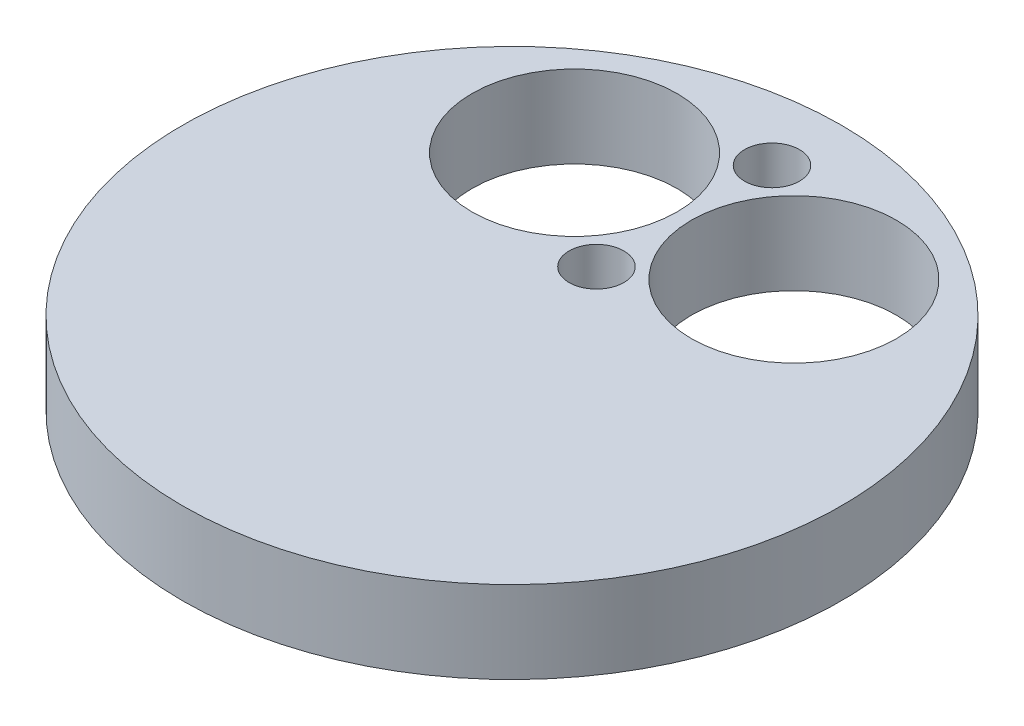
ISO-10303-21;
HEADER;
FILE_DESCRIPTION(('STEP AP214'),'2;1');
FILE_NAME('part.step','',(''),(''),'','','');
FILE_SCHEMA(('AUTOMOTIVE_DESIGN { 1 0 10303 214 1 1 1 1 }'));
ENDSEC;
DATA;
#1=APPLICATION_CONTEXT('core data for automotive mechanical design processes');
#2=APPLICATION_PROTOCOL_DEFINITION('international standard','automotive_design',2000,#1);
#3=PRODUCT_CONTEXT('',#1,'mechanical');
#4=PRODUCT('Part','Part','',(#3));
#5=PRODUCT_RELATED_PRODUCT_CATEGORY('part','',(#4));
#6=PRODUCT_DEFINITION_FORMATION('','',#4);
#7=PRODUCT_DEFINITION_CONTEXT('part definition',#1,'design');
#8=PRODUCT_DEFINITION('design','',#6,#7);
#9=PRODUCT_DEFINITION_SHAPE('','',#8);
#10=(LENGTH_UNIT() NAMED_UNIT(*) SI_UNIT(.MILLI.,.METRE.));
#11=(NAMED_UNIT(*) PLANE_ANGLE_UNIT() SI_UNIT($,.RADIAN.));
#12=(NAMED_UNIT(*) SI_UNIT($,.STERADIAN.) SOLID_ANGLE_UNIT());
#13=UNCERTAINTY_MEASURE_WITH_UNIT(LENGTH_MEASURE(1.E-05),#10,'distance_accuracy_value','');
#14=(GEOMETRIC_REPRESENTATION_CONTEXT(3) GLOBAL_UNCERTAINTY_ASSIGNED_CONTEXT((#13)) GLOBAL_UNIT_ASSIGNED_CONTEXT((#10,
#11,#12)) REPRESENTATION_CONTEXT('',''));
#15=CARTESIAN_POINT('',(0.,0.,0.));
#16=DIRECTION('',(0.,0.,1.));
#17=DIRECTION('',(1.,0.,0.));
#18=AXIS2_PLACEMENT_3D('',#15,#16,#17);
#19=CARTESIAN_POINT('',(0.,9.525,0.));
#20=DIRECTION('',(0.,1.,0.));
#21=DIRECTION('',(0.,0.,1.));
#22=AXIS2_PLACEMENT_3D('',#19,#20,#21);
#23=PLANE('',#22);
#24=CARTESIAN_POINT('',(0.,9.525,-30.099));
#25=DIRECTION('',(0.,1.,0.));
#26=DIRECTION('',(0.,0.,1.));
#27=AXIS2_PLACEMENT_3D('',#24,#25,#26);
#28=CIRCLE('',#27,3.175);
#29=CARTESIAN_POINT('',(0.,9.525,-33.274));
#30=VERTEX_POINT('',#29);
#31=EDGE_CURVE('E55',#30,#30,#28,.T.);
#32=ORIENTED_EDGE('',*,*,#31,.F.);
#33=EDGE_LOOP('',(#32));
#34=FACE_BOUND('',#33,.T.);
#35=CARTESIAN_POINT('',(12.7,9.525,-19.939));
#36=DIRECTION('',(0.,1.,0.));
#37=DIRECTION('',(0.,0.,1.));
#38=AXIS2_PLACEMENT_3D('',#35,#36,#37);
#39=CIRCLE('',#38,11.8745);
#40=CARTESIAN_POINT('',(12.7,9.525,-31.8135));
#41=VERTEX_POINT('',#40);
#42=EDGE_CURVE('E44',#41,#41,#39,.T.);
#43=ORIENTED_EDGE('',*,*,#42,.F.);
#44=EDGE_LOOP('',(#43));
#45=FACE_BOUND('',#44,.T.);
#46=CARTESIAN_POINT('',(0.,9.525,0.));
#47=DIRECTION('',(0.,1.,0.));
#48=DIRECTION('',(0.,0.,1.));
#49=AXIS2_PLACEMENT_3D('',#46,#47,#48);
#50=CIRCLE('',#49,38.1508);
#51=CARTESIAN_POINT('',(0.,9.525,-38.1508));
#52=VERTEX_POINT('',#51);
#53=EDGE_CURVE('E10',#52,#52,#50,.T.);
#54=ORIENTED_EDGE('',*,*,#53,.T.);
#55=EDGE_LOOP('',(#54));
#56=FACE_BOUND('',#55,.T.);
#57=CARTESIAN_POINT('',(-12.7,9.525,-19.939));
#58=DIRECTION('',(0.,1.,0.));
#59=DIRECTION('',(0.,0.,1.));
#60=AXIS2_PLACEMENT_3D('',#57,#58,#59);
#61=CIRCLE('',#60,11.8745);
#62=CARTESIAN_POINT('',(-12.7,9.525,-31.8135));
#63=VERTEX_POINT('',#62);
#64=EDGE_CURVE('E49',#63,#63,#61,.T.);
#65=ORIENTED_EDGE('',*,*,#64,.F.);
#66=EDGE_LOOP('',(#65));
#67=FACE_BOUND('',#66,.T.);
#68=CARTESIAN_POINT('',(0.,9.525,-9.779));
#69=DIRECTION('',(0.,1.,0.));
#70=DIRECTION('',(0.,0.,1.));
#71=AXIS2_PLACEMENT_3D('',#68,#69,#70);
#72=CIRCLE('',#71,3.175);
#73=CARTESIAN_POINT('',(0.,9.525,-12.954));
#74=VERTEX_POINT('',#73);
#75=EDGE_CURVE('E61',#74,#74,#72,.T.);
#76=ORIENTED_EDGE('',*,*,#75,.F.);
#77=EDGE_LOOP('',(#76));
#78=FACE_BOUND('',#77,.T.);
#79=ADVANCED_FACE('F33',(#34,#45,#56,#67,#78),#23,.T.);
#80=CARTESIAN_POINT('',(0.,0.,0.));
#81=DIRECTION('',(0.,1.,0.));
#82=DIRECTION('',(0.,0.,1.));
#83=AXIS2_PLACEMENT_3D('',#80,#81,#82);
#84=PLANE('',#83);
#85=CARTESIAN_POINT('',(0.,0.,0.));
#86=DIRECTION('',(0.,1.,0.));
#87=DIRECTION('',(0.,0.,1.));
#88=AXIS2_PLACEMENT_3D('',#85,#86,#87);
#89=CIRCLE('',#88,38.1508);
#90=CARTESIAN_POINT('',(0.,0.,-38.1508));
#91=VERTEX_POINT('',#90);
#92=EDGE_CURVE('E37',#91,#91,#89,.T.);
#93=ORIENTED_EDGE('',*,*,#92,.F.);
#94=EDGE_LOOP('',(#93));
#95=FACE_BOUND('',#94,.T.);
#96=CARTESIAN_POINT('',(12.7,0.,-19.939));
#97=DIRECTION('',(0.,1.,0.));
#98=DIRECTION('',(0.,0.,1.));
#99=AXIS2_PLACEMENT_3D('',#96,#97,#98);
#100=CIRCLE('',#99,11.8745);
#101=CARTESIAN_POINT('',(12.7,0.,-31.8135));
#102=VERTEX_POINT('',#101);
#103=EDGE_CURVE('E46',#102,#102,#100,.T.);
#104=ORIENTED_EDGE('',*,*,#103,.T.);
#105=EDGE_LOOP('',(#104));
#106=FACE_BOUND('',#105,.T.);
#107=CARTESIAN_POINT('',(-12.7,0.,-19.939));
#108=DIRECTION('',(0.,1.,0.));
#109=DIRECTION('',(0.,0.,1.));
#110=AXIS2_PLACEMENT_3D('',#107,#108,#109);
#111=CIRCLE('',#110,11.8745);
#112=CARTESIAN_POINT('',(-12.7,0.,-31.8135));
#113=VERTEX_POINT('',#112);
#114=EDGE_CURVE('E52',#113,#113,#111,.T.);
#115=ORIENTED_EDGE('',*,*,#114,.T.);
#116=EDGE_LOOP('',(#115));
#117=FACE_BOUND('',#116,.T.);
#118=CARTESIAN_POINT('',(0.,0.,-30.099));
#119=DIRECTION('',(0.,1.,0.));
#120=DIRECTION('',(0.,0.,1.));
#121=AXIS2_PLACEMENT_3D('',#118,#119,#120);
#122=CIRCLE('',#121,3.175);
#123=CARTESIAN_POINT('',(0.,0.,-33.274));
#124=VERTEX_POINT('',#123);
#125=EDGE_CURVE('E58',#124,#124,#122,.T.);
#126=ORIENTED_EDGE('',*,*,#125,.T.);
#127=EDGE_LOOP('',(#126));
#128=FACE_BOUND('',#127,.T.);
#129=CARTESIAN_POINT('',(0.,0.,-9.779));
#130=DIRECTION('',(0.,1.,0.));
#131=DIRECTION('',(0.,0.,1.));
#132=AXIS2_PLACEMENT_3D('',#129,#130,#131);
#133=CIRCLE('',#132,3.175);
#134=CARTESIAN_POINT('',(0.,0.,-12.954));
#135=VERTEX_POINT('',#134);
#136=EDGE_CURVE('E64',#135,#135,#133,.T.);
#137=ORIENTED_EDGE('',*,*,#136,.T.);
#138=EDGE_LOOP('',(#137));
#139=FACE_BOUND('',#138,.T.);
#140=ADVANCED_FACE('F74',(#95,#106,#117,#128,#139),#84,.F.);
#141=CARTESIAN_POINT('',(0.,9.525,0.));
#142=DIRECTION('',(0.,-1.,0.));
#143=DIRECTION('',(0.,0.,-1.));
#144=AXIS2_PLACEMENT_3D('',#141,#142,#143);
#145=CYLINDRICAL_SURFACE('',#144,38.1508);
#146=CARTESIAN_POINT('',(0.,9.525,-38.1508));
#147=CARTESIAN_POINT('',(0.,9.42578125,-38.1508));
#148=CARTESIAN_POINT('',(0.,9.3265625,-38.1508));
#149=CARTESIAN_POINT('',(0.,9.128125,-38.1508));
#150=CARTESIAN_POINT('',(0.,9.02890625,-38.1508));
#151=CARTESIAN_POINT('',(0.,8.83046875,-38.1508));
#152=CARTESIAN_POINT('',(0.,8.73125,-38.1508));
#153=CARTESIAN_POINT('',(0.,8.5328125,-38.1508));
#154=CARTESIAN_POINT('',(0.,8.43359375,-38.1508));
#155=CARTESIAN_POINT('',(0.,8.23515625,-38.1508));
#156=CARTESIAN_POINT('',(0.,8.1359375,-38.1508));
#157=CARTESIAN_POINT('',(0.,7.9375,-38.1508));
#158=CARTESIAN_POINT('',(0.,7.83828125,-38.1508));
#159=CARTESIAN_POINT('',(0.,7.63984375,-38.1508));
#160=CARTESIAN_POINT('',(0.,7.540625,-38.1508));
#161=CARTESIAN_POINT('',(0.,7.3421875,-38.1508));
#162=CARTESIAN_POINT('',(0.,7.24296875,-38.1508));
#163=CARTESIAN_POINT('',(0.,7.04453125,-38.1508));
#164=CARTESIAN_POINT('',(0.,6.9453125,-38.1508));
#165=CARTESIAN_POINT('',(0.,6.746875,-38.1508));
#166=CARTESIAN_POINT('',(0.,6.64765625,-38.1508));
#167=CARTESIAN_POINT('',(0.,6.44921875,-38.1508));
#168=CARTESIAN_POINT('',(0.,6.35,-38.1508));
#169=CARTESIAN_POINT('',(0.,6.1515625,-38.1508));
#170=CARTESIAN_POINT('',(0.,6.05234375,-38.1508));
#171=CARTESIAN_POINT('',(0.,5.85390625,-38.1508));
#172=CARTESIAN_POINT('',(0.,5.7546875,-38.1508));
#173=CARTESIAN_POINT('',(0.,5.55625,-38.1508));
#174=CARTESIAN_POINT('',(0.,5.45703125,-38.1508));
#175=CARTESIAN_POINT('',(0.,5.25859375,-38.1508));
#176=CARTESIAN_POINT('',(0.,5.159375,-38.1508));
#177=CARTESIAN_POINT('',(0.,4.9609375,-38.1508));
#178=CARTESIAN_POINT('',(0.,4.86171875,-38.1508));
#179=CARTESIAN_POINT('',(0.,4.66328125,-38.1508));
#180=CARTESIAN_POINT('',(0.,4.5640625,-38.1508));
#181=CARTESIAN_POINT('',(0.,4.365625,-38.1508));
#182=CARTESIAN_POINT('',(0.,4.26640625,-38.1508));
#183=CARTESIAN_POINT('',(0.,4.06796875,-38.1508));
#184=CARTESIAN_POINT('',(0.,3.96875,-38.1508));
#185=CARTESIAN_POINT('',(0.,3.7703125,-38.1508));
#186=CARTESIAN_POINT('',(0.,3.67109375,-38.1508));
#187=CARTESIAN_POINT('',(0.,3.47265625,-38.1508));
#188=CARTESIAN_POINT('',(0.,3.3734375,-38.1508));
#189=CARTESIAN_POINT('',(0.,3.175,-38.1508));
#190=CARTESIAN_POINT('',(0.,3.07578125,-38.1508));
#191=CARTESIAN_POINT('',(0.,2.87734375,-38.1508));
#192=CARTESIAN_POINT('',(0.,2.778125,-38.1508));
#193=CARTESIAN_POINT('',(0.,2.5796875,-38.1508));
#194=CARTESIAN_POINT('',(0.,2.48046875,-38.1508));
#195=CARTESIAN_POINT('',(0.,2.28203125,-38.1508));
#196=CARTESIAN_POINT('',(0.,2.1828125,-38.1508));
#197=CARTESIAN_POINT('',(0.,1.984375,-38.1508));
#198=CARTESIAN_POINT('',(0.,1.88515625,-38.1508));
#199=CARTESIAN_POINT('',(0.,1.68671875,-38.1508));
#200=CARTESIAN_POINT('',(0.,1.5875,-38.1508));
#201=CARTESIAN_POINT('',(0.,1.3890625,-38.1508));
#202=CARTESIAN_POINT('',(0.,1.28984375,-38.1508));
#203=CARTESIAN_POINT('',(0.,1.09140625,-38.1508));
#204=CARTESIAN_POINT('',(0.,0.992187500000001,-38.1508));
#205=CARTESIAN_POINT('',(0.,0.793750000000001,-38.1508));
#206=CARTESIAN_POINT('',(0.,0.69453125,-38.1508));
#207=CARTESIAN_POINT('',(0.,0.49609375,-38.1508));
#208=CARTESIAN_POINT('',(0.,0.396875,-38.1508));
#209=CARTESIAN_POINT('',(0.,0.1984375,-38.1508));
#210=CARTESIAN_POINT('',(0.,0.0992187500000001,-38.1508));
#211=CARTESIAN_POINT('',(0.,0.,-38.1508));
#212=B_SPLINE_CURVE_WITH_KNOTS('',3,(#146,#147,#148,#149,#150,#151,#152,#153,#154,#155,#156,
#157,#158,#159,#160,#161,#162,#163,#164,#165,#166,#167,#168,#169,#170,#171,#172,#173,#174,#175,
#176,#177,#178,#179,#180,#181,#182,#183,#184,#185,#186,#187,#188,#189,#190,#191,#192,#193,#194,
#195,#196,#197,#198,#199,#200,#201,#202,#203,#204,#205,#206,#207,#208,#209,#210,#211),
.UNSPECIFIED.,.F.,.F.,(4,2,2,2,2,2,2,2,2,2,2,2,2,2,2,2,2,2,2,2,2,2,2,2,2,2,2,2,2,2,2,2,4),(0.,
0.297656249999998,0.595312499999999,0.892968749999999,1.190625,1.48828125,1.7859375,2.08359375,
2.38125,2.67890625,2.9765625,3.27421875,3.571875,3.86953125,4.1671875,4.46484375,4.7625,
5.06015625,5.3578125,5.65546875,5.953125,6.25078125,6.5484375,6.84609375,7.14375,7.44140625,
7.7390625,8.03671875,8.334375,8.63203125,8.9296875,9.22734375,9.525),.UNSPECIFIED.);
#213=EDGE_CURVE('BSEAM35',#52,#91,#212,.T.);
#214=ORIENTED_EDGE('',*,*,#53,.F.);
#215=ORIENTED_EDGE('',*,*,#92,.T.);
#216=ORIENTED_EDGE('',*,*,#213,.T.);
#217=ORIENTED_EDGE('',*,*,#213,.F.);
#218=EDGE_LOOP('',(#214,#216,#215,#217));
#219=FACE_BOUND('',#218,.T.);
#220=ADVANCED_FACE('F35',(#219),#145,.T.);
#221=CARTESIAN_POINT('',(12.7,9.525,-19.939));
#222=DIRECTION('',(0.,-1.,0.));
#223=DIRECTION('',(0.,0.,-1.));
#224=AXIS2_PLACEMENT_3D('',#221,#222,#223);
#225=CYLINDRICAL_SURFACE('',#224,11.8745);
#226=CARTESIAN_POINT('',(12.7,9.525,-31.8135));
#227=CARTESIAN_POINT('',(12.7,9.42578125,-31.8135));
#228=CARTESIAN_POINT('',(12.7,9.3265625,-31.8135));
#229=CARTESIAN_POINT('',(12.7,9.128125,-31.8135));
#230=CARTESIAN_POINT('',(12.7,9.02890625,-31.8135));
#231=CARTESIAN_POINT('',(12.7,8.83046875,-31.8135));
#232=CARTESIAN_POINT('',(12.7,8.73125,-31.8135));
#233=CARTESIAN_POINT('',(12.7,8.5328125,-31.8135));
#234=CARTESIAN_POINT('',(12.7,8.43359375,-31.8135));
#235=CARTESIAN_POINT('',(12.7,8.23515625,-31.8135));
#236=CARTESIAN_POINT('',(12.7,8.1359375,-31.8135));
#237=CARTESIAN_POINT('',(12.7,7.9375,-31.8135));
#238=CARTESIAN_POINT('',(12.7,7.83828125,-31.8135));
#239=CARTESIAN_POINT('',(12.7,7.63984375,-31.8135));
#240=CARTESIAN_POINT('',(12.7,7.540625,-31.8135));
#241=CARTESIAN_POINT('',(12.7,7.3421875,-31.8135));
#242=CARTESIAN_POINT('',(12.7,7.24296875,-31.8135));
#243=CARTESIAN_POINT('',(12.7,7.04453125,-31.8135));
#244=CARTESIAN_POINT('',(12.7,6.9453125,-31.8135));
#245=CARTESIAN_POINT('',(12.7,6.746875,-31.8135));
#246=CARTESIAN_POINT('',(12.7,6.64765625,-31.8135));
#247=CARTESIAN_POINT('',(12.7,6.44921875,-31.8135));
#248=CARTESIAN_POINT('',(12.7,6.35,-31.8135));
#249=CARTESIAN_POINT('',(12.7,6.1515625,-31.8135));
#250=CARTESIAN_POINT('',(12.7,6.05234375,-31.8135));
#251=CARTESIAN_POINT('',(12.7,5.85390625,-31.8135));
#252=CARTESIAN_POINT('',(12.7,5.7546875,-31.8135));
#253=CARTESIAN_POINT('',(12.7,5.55625,-31.8135));
#254=CARTESIAN_POINT('',(12.7,5.45703125,-31.8135));
#255=CARTESIAN_POINT('',(12.7,5.25859375,-31.8135));
#256=CARTESIAN_POINT('',(12.7,5.159375,-31.8135));
#257=CARTESIAN_POINT('',(12.7,4.9609375,-31.8135));
#258=CARTESIAN_POINT('',(12.7,4.86171875,-31.8135));
#259=CARTESIAN_POINT('',(12.7,4.66328125,-31.8135));
#260=CARTESIAN_POINT('',(12.7,4.5640625,-31.8135));
#261=CARTESIAN_POINT('',(12.7,4.365625,-31.8135));
#262=CARTESIAN_POINT('',(12.7,4.26640625,-31.8135));
#263=CARTESIAN_POINT('',(12.7,4.06796875,-31.8135));
#264=CARTESIAN_POINT('',(12.7,3.96875,-31.8135));
#265=CARTESIAN_POINT('',(12.7,3.7703125,-31.8135));
#266=CARTESIAN_POINT('',(12.7,3.67109375,-31.8135));
#267=CARTESIAN_POINT('',(12.7,3.47265625,-31.8135));
#268=CARTESIAN_POINT('',(12.7,3.3734375,-31.8135));
#269=CARTESIAN_POINT('',(12.7,3.175,-31.8135));
#270=CARTESIAN_POINT('',(12.7,3.07578125,-31.8135));
#271=CARTESIAN_POINT('',(12.7,2.87734375,-31.8135));
#272=CARTESIAN_POINT('',(12.7,2.778125,-31.8135));
#273=CARTESIAN_POINT('',(12.7,2.5796875,-31.8135));
#274=CARTESIAN_POINT('',(12.7,2.48046875,-31.8135));
#275=CARTESIAN_POINT('',(12.7,2.28203125,-31.8135));
#276=CARTESIAN_POINT('',(12.7,2.1828125,-31.8135));
#277=CARTESIAN_POINT('',(12.7,1.984375,-31.8135));
#278=CARTESIAN_POINT('',(12.7,1.88515625,-31.8135));
#279=CARTESIAN_POINT('',(12.7,1.68671875,-31.8135));
#280=CARTESIAN_POINT('',(12.7,1.5875,-31.8135));
#281=CARTESIAN_POINT('',(12.7,1.3890625,-31.8135));
#282=CARTESIAN_POINT('',(12.7,1.28984375,-31.8135));
#283=CARTESIAN_POINT('',(12.7,1.09140625,-31.8135));
#284=CARTESIAN_POINT('',(12.7,0.992187500000001,-31.8135));
#285=CARTESIAN_POINT('',(12.7,0.793750000000001,-31.8135));
#286=CARTESIAN_POINT('',(12.7,0.69453125,-31.8135));
#287=CARTESIAN_POINT('',(12.7,0.49609375,-31.8135));
#288=CARTESIAN_POINT('',(12.7,0.396875,-31.8135));
#289=CARTESIAN_POINT('',(12.7,0.1984375,-31.8135));
#290=CARTESIAN_POINT('',(12.7,0.0992187500000001,-31.8135));
#291=CARTESIAN_POINT('',(12.7,0.,-31.8135));
#292=B_SPLINE_CURVE_WITH_KNOTS('',3,(#226,#227,#228,#229,#230,#231,#232,#233,#234,#235,#236,
#237,#238,#239,#240,#241,#242,#243,#244,#245,#246,#247,#248,#249,#250,#251,#252,#253,#254,#255,
#256,#257,#258,#259,#260,#261,#262,#263,#264,#265,#266,#267,#268,#269,#270,#271,#272,#273,#274,
#275,#276,#277,#278,#279,#280,#281,#282,#283,#284,#285,#286,#287,#288,#289,#290,#291),
.UNSPECIFIED.,.F.,.F.,(4,2,2,2,2,2,2,2,2,2,2,2,2,2,2,2,2,2,2,2,2,2,2,2,2,2,2,2,2,2,2,2,4),(0.,
0.297656249999998,0.595312499999999,0.892968749999999,1.190625,1.48828125,1.7859375,2.08359375,
2.38125,2.67890625,2.9765625,3.27421875,3.571875,3.86953125,4.1671875,4.46484375,4.7625,
5.06015625,5.3578125,5.65546875,5.953125,6.25078125,6.5484375,6.84609375,7.14375,7.44140625,
7.7390625,8.03671875,8.334375,8.63203125,8.9296875,9.22734375,9.525),.UNSPECIFIED.);
#293=EDGE_CURVE('BSEAM84',#41,#102,#292,.T.);
#294=ORIENTED_EDGE('',*,*,#42,.T.);
#295=ORIENTED_EDGE('',*,*,#103,.F.);
#296=ORIENTED_EDGE('',*,*,#293,.T.);
#297=ORIENTED_EDGE('',*,*,#293,.F.);
#298=EDGE_LOOP('',(#294,#296,#295,#297));
#299=FACE_BOUND('',#298,.T.);
#300=ADVANCED_FACE('F84',(#299),#225,.F.);
#301=CARTESIAN_POINT('',(-12.7,9.525,-19.939));
#302=DIRECTION('',(0.,-1.,0.));
#303=DIRECTION('',(0.,0.,-1.));
#304=AXIS2_PLACEMENT_3D('',#301,#302,#303);
#305=CYLINDRICAL_SURFACE('',#304,11.8745);
#306=CARTESIAN_POINT('',(-12.7,9.525,-31.8135));
#307=CARTESIAN_POINT('',(-12.7,9.42578125,-31.8135));
#308=CARTESIAN_POINT('',(-12.7,9.3265625,-31.8135));
#309=CARTESIAN_POINT('',(-12.7,9.128125,-31.8135));
#310=CARTESIAN_POINT('',(-12.7,9.02890625,-31.8135));
#311=CARTESIAN_POINT('',(-12.7,8.83046875,-31.8135));
#312=CARTESIAN_POINT('',(-12.7,8.73125,-31.8135));
#313=CARTESIAN_POINT('',(-12.7,8.5328125,-31.8135));
#314=CARTESIAN_POINT('',(-12.7,8.43359375,-31.8135));
#315=CARTESIAN_POINT('',(-12.7,8.23515625,-31.8135));
#316=CARTESIAN_POINT('',(-12.7,8.1359375,-31.8135));
#317=CARTESIAN_POINT('',(-12.7,7.9375,-31.8135));
#318=CARTESIAN_POINT('',(-12.7,7.83828125,-31.8135));
#319=CARTESIAN_POINT('',(-12.7,7.63984375,-31.8135));
#320=CARTESIAN_POINT('',(-12.7,7.540625,-31.8135));
#321=CARTESIAN_POINT('',(-12.7,7.3421875,-31.8135));
#322=CARTESIAN_POINT('',(-12.7,7.24296875,-31.8135));
#323=CARTESIAN_POINT('',(-12.7,7.04453125,-31.8135));
#324=CARTESIAN_POINT('',(-12.7,6.9453125,-31.8135));
#325=CARTESIAN_POINT('',(-12.7,6.746875,-31.8135));
#326=CARTESIAN_POINT('',(-12.7,6.64765625,-31.8135));
#327=CARTESIAN_POINT('',(-12.7,6.44921875,-31.8135));
#328=CARTESIAN_POINT('',(-12.7,6.35,-31.8135));
#329=CARTESIAN_POINT('',(-12.7,6.1515625,-31.8135));
#330=CARTESIAN_POINT('',(-12.7,6.05234375,-31.8135));
#331=CARTESIAN_POINT('',(-12.7,5.85390625,-31.8135));
#332=CARTESIAN_POINT('',(-12.7,5.7546875,-31.8135));
#333=CARTESIAN_POINT('',(-12.7,5.55625,-31.8135));
#334=CARTESIAN_POINT('',(-12.7,5.45703125,-31.8135));
#335=CARTESIAN_POINT('',(-12.7,5.25859375,-31.8135));
#336=CARTESIAN_POINT('',(-12.7,5.159375,-31.8135));
#337=CARTESIAN_POINT('',(-12.7,4.9609375,-31.8135));
#338=CARTESIAN_POINT('',(-12.7,4.86171875,-31.8135));
#339=CARTESIAN_POINT('',(-12.7,4.66328125,-31.8135));
#340=CARTESIAN_POINT('',(-12.7,4.5640625,-31.8135));
#341=CARTESIAN_POINT('',(-12.7,4.365625,-31.8135));
#342=CARTESIAN_POINT('',(-12.7,4.26640625,-31.8135));
#343=CARTESIAN_POINT('',(-12.7,4.06796875,-31.8135));
#344=CARTESIAN_POINT('',(-12.7,3.96875,-31.8135));
#345=CARTESIAN_POINT('',(-12.7,3.7703125,-31.8135));
#346=CARTESIAN_POINT('',(-12.7,3.67109375,-31.8135));
#347=CARTESIAN_POINT('',(-12.7,3.47265625,-31.8135));
#348=CARTESIAN_POINT('',(-12.7,3.3734375,-31.8135));
#349=CARTESIAN_POINT('',(-12.7,3.175,-31.8135));
#350=CARTESIAN_POINT('',(-12.7,3.07578125,-31.8135));
#351=CARTESIAN_POINT('',(-12.7,2.87734375,-31.8135));
#352=CARTESIAN_POINT('',(-12.7,2.778125,-31.8135));
#353=CARTESIAN_POINT('',(-12.7,2.5796875,-31.8135));
#354=CARTESIAN_POINT('',(-12.7,2.48046875,-31.8135));
#355=CARTESIAN_POINT('',(-12.7,2.28203125,-31.8135));
#356=CARTESIAN_POINT('',(-12.7,2.1828125,-31.8135));
#357=CARTESIAN_POINT('',(-12.7,1.984375,-31.8135));
#358=CARTESIAN_POINT('',(-12.7,1.88515625,-31.8135));
#359=CARTESIAN_POINT('',(-12.7,1.68671875,-31.8135));
#360=CARTESIAN_POINT('',(-12.7,1.5875,-31.8135));
#361=CARTESIAN_POINT('',(-12.7,1.3890625,-31.8135));
#362=CARTESIAN_POINT('',(-12.7,1.28984375,-31.8135));
#363=CARTESIAN_POINT('',(-12.7,1.09140625,-31.8135));
#364=CARTESIAN_POINT('',(-12.7,0.992187500000001,-31.8135));
#365=CARTESIAN_POINT('',(-12.7,0.793750000000001,-31.8135));
#366=CARTESIAN_POINT('',(-12.7,0.69453125,-31.8135));
#367=CARTESIAN_POINT('',(-12.7,0.49609375,-31.8135));
#368=CARTESIAN_POINT('',(-12.7,0.396875,-31.8135));
#369=CARTESIAN_POINT('',(-12.7,0.1984375,-31.8135));
#370=CARTESIAN_POINT('',(-12.7,0.0992187500000001,-31.8135));
#371=CARTESIAN_POINT('',(-12.7,0.,-31.8135));
#372=B_SPLINE_CURVE_WITH_KNOTS('',3,(#306,#307,#308,#309,#310,#311,#312,#313,#314,#315,#316,
#317,#318,#319,#320,#321,#322,#323,#324,#325,#326,#327,#328,#329,#330,#331,#332,#333,#334,#335,
#336,#337,#338,#339,#340,#341,#342,#343,#344,#345,#346,#347,#348,#349,#350,#351,#352,#353,#354,
#355,#356,#357,#358,#359,#360,#361,#362,#363,#364,#365,#366,#367,#368,#369,#370,#371),
.UNSPECIFIED.,.F.,.F.,(4,2,2,2,2,2,2,2,2,2,2,2,2,2,2,2,2,2,2,2,2,2,2,2,2,2,2,2,2,2,2,2,4),(0.,
0.297656249999998,0.595312499999999,0.892968749999999,1.190625,1.48828125,1.7859375,2.08359375,
2.38125,2.67890625,2.9765625,3.27421875,3.571875,3.86953125,4.1671875,4.46484375,4.7625,
5.06015625,5.3578125,5.65546875,5.953125,6.25078125,6.5484375,6.84609375,7.14375,7.44140625,
7.7390625,8.03671875,8.334375,8.63203125,8.9296875,9.22734375,9.525),.UNSPECIFIED.);
#373=EDGE_CURVE('BSEAM87',#63,#113,#372,.T.);
#374=ORIENTED_EDGE('',*,*,#64,.T.);
#375=ORIENTED_EDGE('',*,*,#114,.F.);
#376=ORIENTED_EDGE('',*,*,#373,.T.);
#377=ORIENTED_EDGE('',*,*,#373,.F.);
#378=EDGE_LOOP('',(#374,#376,#375,#377));
#379=FACE_BOUND('',#378,.T.);
#380=ADVANCED_FACE('F87',(#379),#305,.F.);
#381=CARTESIAN_POINT('',(0.,9.525,-30.099));
#382=DIRECTION('',(0.,-1.,0.));
#383=DIRECTION('',(0.,0.,-1.));
#384=AXIS2_PLACEMENT_3D('',#381,#382,#383);
#385=CYLINDRICAL_SURFACE('',#384,3.175);
#386=CARTESIAN_POINT('',(0.,9.525,-33.274));
#387=CARTESIAN_POINT('',(0.,9.42578125,-33.274));
#388=CARTESIAN_POINT('',(0.,9.3265625,-33.274));
#389=CARTESIAN_POINT('',(0.,9.128125,-33.274));
#390=CARTESIAN_POINT('',(0.,9.02890625,-33.274));
#391=CARTESIAN_POINT('',(0.,8.83046875,-33.274));
#392=CARTESIAN_POINT('',(0.,8.73125,-33.274));
#393=CARTESIAN_POINT('',(0.,8.5328125,-33.274));
#394=CARTESIAN_POINT('',(0.,8.43359375,-33.274));
#395=CARTESIAN_POINT('',(0.,8.23515625,-33.274));
#396=CARTESIAN_POINT('',(0.,8.1359375,-33.274));
#397=CARTESIAN_POINT('',(0.,7.9375,-33.274));
#398=CARTESIAN_POINT('',(0.,7.83828125,-33.274));
#399=CARTESIAN_POINT('',(0.,7.63984375,-33.274));
#400=CARTESIAN_POINT('',(0.,7.540625,-33.274));
#401=CARTESIAN_POINT('',(0.,7.3421875,-33.274));
#402=CARTESIAN_POINT('',(0.,7.24296875,-33.274));
#403=CARTESIAN_POINT('',(0.,7.04453125,-33.274));
#404=CARTESIAN_POINT('',(0.,6.9453125,-33.274));
#405=CARTESIAN_POINT('',(0.,6.746875,-33.274));
#406=CARTESIAN_POINT('',(0.,6.64765625,-33.274));
#407=CARTESIAN_POINT('',(0.,6.44921875,-33.274));
#408=CARTESIAN_POINT('',(0.,6.35,-33.274));
#409=CARTESIAN_POINT('',(0.,6.1515625,-33.274));
#410=CARTESIAN_POINT('',(0.,6.05234375,-33.274));
#411=CARTESIAN_POINT('',(0.,5.85390625,-33.274));
#412=CARTESIAN_POINT('',(0.,5.7546875,-33.274));
#413=CARTESIAN_POINT('',(0.,5.55625,-33.274));
#414=CARTESIAN_POINT('',(0.,5.45703125,-33.274));
#415=CARTESIAN_POINT('',(0.,5.25859375,-33.274));
#416=CARTESIAN_POINT('',(0.,5.159375,-33.274));
#417=CARTESIAN_POINT('',(0.,4.9609375,-33.274));
#418=CARTESIAN_POINT('',(0.,4.86171875,-33.274));
#419=CARTESIAN_POINT('',(0.,4.66328125,-33.274));
#420=CARTESIAN_POINT('',(0.,4.5640625,-33.274));
#421=CARTESIAN_POINT('',(0.,4.365625,-33.274));
#422=CARTESIAN_POINT('',(0.,4.26640625,-33.274));
#423=CARTESIAN_POINT('',(0.,4.06796875,-33.274));
#424=CARTESIAN_POINT('',(0.,3.96875,-33.274));
#425=CARTESIAN_POINT('',(0.,3.7703125,-33.274));
#426=CARTESIAN_POINT('',(0.,3.67109375,-33.274));
#427=CARTESIAN_POINT('',(0.,3.47265625,-33.274));
#428=CARTESIAN_POINT('',(0.,3.3734375,-33.274));
#429=CARTESIAN_POINT('',(0.,3.175,-33.274));
#430=CARTESIAN_POINT('',(0.,3.07578125,-33.274));
#431=CARTESIAN_POINT('',(0.,2.87734375,-33.274));
#432=CARTESIAN_POINT('',(0.,2.778125,-33.274));
#433=CARTESIAN_POINT('',(0.,2.5796875,-33.274));
#434=CARTESIAN_POINT('',(0.,2.48046875,-33.274));
#435=CARTESIAN_POINT('',(0.,2.28203125,-33.274));
#436=CARTESIAN_POINT('',(0.,2.1828125,-33.274));
#437=CARTESIAN_POINT('',(0.,1.984375,-33.274));
#438=CARTESIAN_POINT('',(0.,1.88515625,-33.274));
#439=CARTESIAN_POINT('',(0.,1.68671875,-33.274));
#440=CARTESIAN_POINT('',(0.,1.5875,-33.274));
#441=CARTESIAN_POINT('',(0.,1.3890625,-33.274));
#442=CARTESIAN_POINT('',(0.,1.28984375,-33.274));
#443=CARTESIAN_POINT('',(0.,1.09140625,-33.274));
#444=CARTESIAN_POINT('',(0.,0.992187500000001,-33.274));
#445=CARTESIAN_POINT('',(0.,0.793750000000001,-33.274));
#446=CARTESIAN_POINT('',(0.,0.69453125,-33.274));
#447=CARTESIAN_POINT('',(0.,0.49609375,-33.274));
#448=CARTESIAN_POINT('',(0.,0.396875,-33.274));
#449=CARTESIAN_POINT('',(0.,0.1984375,-33.274));
#450=CARTESIAN_POINT('',(0.,0.0992187500000001,-33.274));
#451=CARTESIAN_POINT('',(0.,0.,-33.274));
#452=B_SPLINE_CURVE_WITH_KNOTS('',3,(#386,#387,#388,#389,#390,#391,#392,#393,#394,#395,#396,
#397,#398,#399,#400,#401,#402,#403,#404,#405,#406,#407,#408,#409,#410,#411,#412,#413,#414,#415,
#416,#417,#418,#419,#420,#421,#422,#423,#424,#425,#426,#427,#428,#429,#430,#431,#432,#433,#434,
#435,#436,#437,#438,#439,#440,#441,#442,#443,#444,#445,#446,#447,#448,#449,#450,#451),
.UNSPECIFIED.,.F.,.F.,(4,2,2,2,2,2,2,2,2,2,2,2,2,2,2,2,2,2,2,2,2,2,2,2,2,2,2,2,2,2,2,2,4),(0.,
0.29765625,0.5953125,0.892968750000001,1.190625,1.48828125,1.7859375,2.08359375,2.38125,
2.67890625,2.9765625,3.27421875,3.571875,3.86953125,4.1671875,4.46484375,4.7625,5.06015625,
5.3578125,5.65546875,5.953125,6.25078125,6.5484375,6.84609375,7.14375,7.44140625,7.7390625,
8.03671875,8.334375,8.63203125,8.9296875,9.22734375,9.525),.UNSPECIFIED.);
#453=EDGE_CURVE('BSEAM91',#30,#124,#452,.T.);
#454=ORIENTED_EDGE('',*,*,#31,.T.);
#455=ORIENTED_EDGE('',*,*,#125,.F.);
#456=ORIENTED_EDGE('',*,*,#453,.T.);
#457=ORIENTED_EDGE('',*,*,#453,.F.);
#458=EDGE_LOOP('',(#454,#456,#455,#457));
#459=FACE_BOUND('',#458,.T.);
#460=ADVANCED_FACE('F91',(#459),#385,.F.);
#461=CARTESIAN_POINT('',(0.,9.525,-9.779));
#462=DIRECTION('',(0.,-1.,0.));
#463=DIRECTION('',(0.,0.,-1.));
#464=AXIS2_PLACEMENT_3D('',#461,#462,#463);
#465=CYLINDRICAL_SURFACE('',#464,3.175);
#466=CARTESIAN_POINT('',(0.,9.525,-12.954));
#467=CARTESIAN_POINT('',(0.,9.42578125,-12.954));
#468=CARTESIAN_POINT('',(0.,9.3265625,-12.954));
#469=CARTESIAN_POINT('',(0.,9.128125,-12.954));
#470=CARTESIAN_POINT('',(0.,9.02890625,-12.954));
#471=CARTESIAN_POINT('',(0.,8.83046875,-12.954));
#472=CARTESIAN_POINT('',(0.,8.73125,-12.954));
#473=CARTESIAN_POINT('',(0.,8.5328125,-12.954));
#474=CARTESIAN_POINT('',(0.,8.43359375,-12.954));
#475=CARTESIAN_POINT('',(0.,8.23515625,-12.954));
#476=CARTESIAN_POINT('',(0.,8.1359375,-12.954));
#477=CARTESIAN_POINT('',(0.,7.9375,-12.954));
#478=CARTESIAN_POINT('',(0.,7.83828125,-12.954));
#479=CARTESIAN_POINT('',(0.,7.63984375,-12.954));
#480=CARTESIAN_POINT('',(0.,7.540625,-12.954));
#481=CARTESIAN_POINT('',(0.,7.3421875,-12.954));
#482=CARTESIAN_POINT('',(0.,7.24296875,-12.954));
#483=CARTESIAN_POINT('',(0.,7.04453125,-12.954));
#484=CARTESIAN_POINT('',(0.,6.9453125,-12.954));
#485=CARTESIAN_POINT('',(0.,6.746875,-12.954));
#486=CARTESIAN_POINT('',(0.,6.64765625,-12.954));
#487=CARTESIAN_POINT('',(0.,6.44921875,-12.954));
#488=CARTESIAN_POINT('',(0.,6.35,-12.954));
#489=CARTESIAN_POINT('',(0.,6.1515625,-12.954));
#490=CARTESIAN_POINT('',(0.,6.05234375,-12.954));
#491=CARTESIAN_POINT('',(0.,5.85390625,-12.954));
#492=CARTESIAN_POINT('',(0.,5.7546875,-12.954));
#493=CARTESIAN_POINT('',(0.,5.55625,-12.954));
#494=CARTESIAN_POINT('',(0.,5.45703125,-12.954));
#495=CARTESIAN_POINT('',(0.,5.25859375,-12.954));
#496=CARTESIAN_POINT('',(0.,5.159375,-12.954));
#497=CARTESIAN_POINT('',(0.,4.9609375,-12.954));
#498=CARTESIAN_POINT('',(0.,4.86171875,-12.954));
#499=CARTESIAN_POINT('',(0.,4.66328125,-12.954));
#500=CARTESIAN_POINT('',(0.,4.5640625,-12.954));
#501=CARTESIAN_POINT('',(0.,4.365625,-12.954));
#502=CARTESIAN_POINT('',(0.,4.26640625,-12.954));
#503=CARTESIAN_POINT('',(0.,4.06796875,-12.954));
#504=CARTESIAN_POINT('',(0.,3.96875,-12.954));
#505=CARTESIAN_POINT('',(0.,3.7703125,-12.954));
#506=CARTESIAN_POINT('',(0.,3.67109375,-12.954));
#507=CARTESIAN_POINT('',(0.,3.47265625,-12.954));
#508=CARTESIAN_POINT('',(0.,3.3734375,-12.954));
#509=CARTESIAN_POINT('',(0.,3.175,-12.954));
#510=CARTESIAN_POINT('',(0.,3.07578125,-12.954));
#511=CARTESIAN_POINT('',(0.,2.87734375,-12.954));
#512=CARTESIAN_POINT('',(0.,2.778125,-12.954));
#513=CARTESIAN_POINT('',(0.,2.5796875,-12.954));
#514=CARTESIAN_POINT('',(0.,2.48046875,-12.954));
#515=CARTESIAN_POINT('',(0.,2.28203125,-12.954));
#516=CARTESIAN_POINT('',(0.,2.1828125,-12.954));
#517=CARTESIAN_POINT('',(0.,1.984375,-12.954));
#518=CARTESIAN_POINT('',(0.,1.88515625,-12.954));
#519=CARTESIAN_POINT('',(0.,1.68671875,-12.954));
#520=CARTESIAN_POINT('',(0.,1.5875,-12.954));
#521=CARTESIAN_POINT('',(0.,1.3890625,-12.954));
#522=CARTESIAN_POINT('',(0.,1.28984375,-12.954));
#523=CARTESIAN_POINT('',(0.,1.09140625,-12.954));
#524=CARTESIAN_POINT('',(0.,0.992187500000001,-12.954));
#525=CARTESIAN_POINT('',(0.,0.793750000000001,-12.954));
#526=CARTESIAN_POINT('',(0.,0.69453125,-12.954));
#527=CARTESIAN_POINT('',(0.,0.49609375,-12.954));
#528=CARTESIAN_POINT('',(0.,0.396875,-12.954));
#529=CARTESIAN_POINT('',(0.,0.1984375,-12.954));
#530=CARTESIAN_POINT('',(0.,0.0992187500000001,-12.954));
#531=CARTESIAN_POINT('',(0.,0.,-12.954));
#532=B_SPLINE_CURVE_WITH_KNOTS('',3,(#466,#467,#468,#469,#470,#471,#472,#473,#474,#475,#476,
#477,#478,#479,#480,#481,#482,#483,#484,#485,#486,#487,#488,#489,#490,#491,#492,#493,#494,#495,
#496,#497,#498,#499,#500,#501,#502,#503,#504,#505,#506,#507,#508,#509,#510,#511,#512,#513,#514,
#515,#516,#517,#518,#519,#520,#521,#522,#523,#524,#525,#526,#527,#528,#529,#530,#531),
.UNSPECIFIED.,.F.,.F.,(4,2,2,2,2,2,2,2,2,2,2,2,2,2,2,2,2,2,2,2,2,2,2,2,2,2,2,2,2,2,2,2,4),(0.,
0.29765625,0.5953125,0.892968750000001,1.190625,1.48828125,1.7859375,2.08359375,2.38125,
2.67890625,2.9765625,3.27421875,3.571875,3.86953125,4.1671875,4.46484375,4.7625,5.06015625,
5.3578125,5.65546875,5.953125,6.25078125,6.5484375,6.84609375,7.14375,7.44140625,7.7390625,
8.03671875,8.334375,8.63203125,8.9296875,9.22734375,9.525),.UNSPECIFIED.);
#533=EDGE_CURVE('BSEAM70',#74,#135,#532,.T.);
#534=ORIENTED_EDGE('',*,*,#75,.T.);
#535=ORIENTED_EDGE('',*,*,#136,.F.);
#536=ORIENTED_EDGE('',*,*,#533,.T.);
#537=ORIENTED_EDGE('',*,*,#533,.F.);
#538=EDGE_LOOP('',(#534,#536,#535,#537));
#539=FACE_BOUND('',#538,.T.);
#540=ADVANCED_FACE('F70',(#539),#465,.F.);
#541=CLOSED_SHELL('',(#79,#140,#220,#300,#380,#460,#540));
#542=MANIFOLD_SOLID_BREP('B2',#541);
#543=ADVANCED_BREP_SHAPE_REPRESENTATION('',(#18,#542),#14);
#544=SHAPE_DEFINITION_REPRESENTATION(#9,#543);
ENDSEC;
END-ISO-10303-21;
